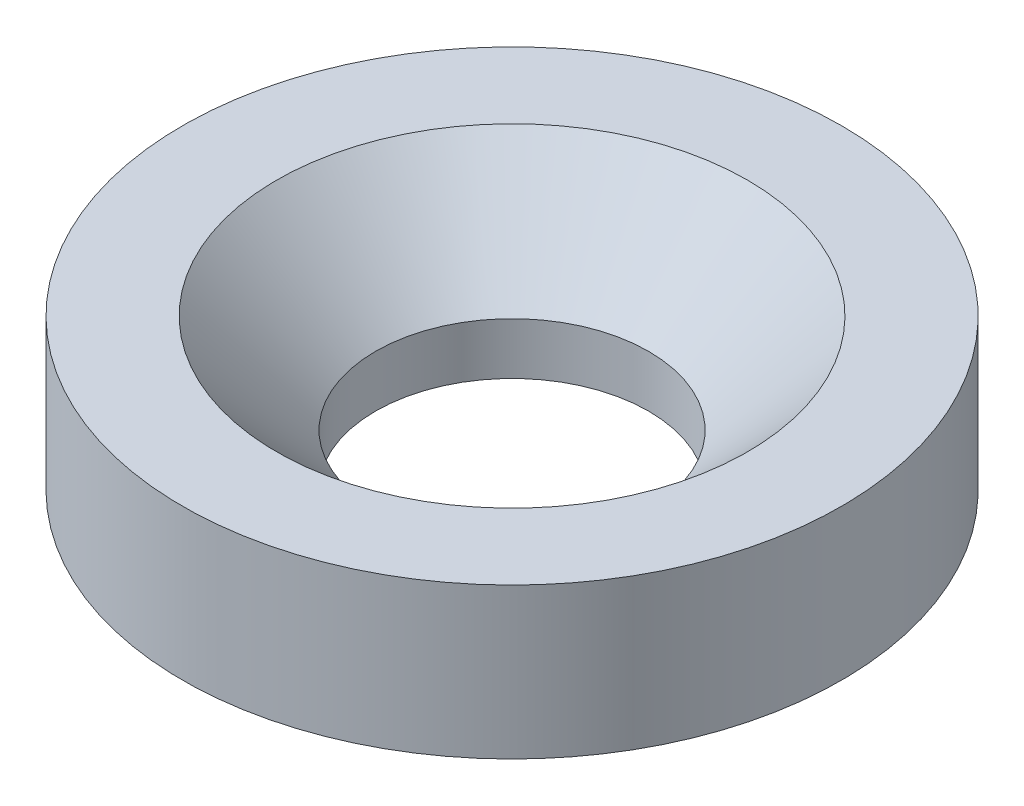
ISO-10303-21;
HEADER;
FILE_DESCRIPTION(('STEP AP214'),'2;1');
FILE_NAME('part.step','',(''),(''),'','','');
FILE_SCHEMA(('AUTOMOTIVE_DESIGN { 1 0 10303 214 1 1 1 1 }'));
ENDSEC;
DATA;
#1=APPLICATION_CONTEXT('core data for automotive mechanical design processes');
#2=APPLICATION_PROTOCOL_DEFINITION('international standard','automotive_design',2000,#1);
#3=PRODUCT_CONTEXT('',#1,'mechanical');
#4=PRODUCT('Part','Part','',(#3));
#5=PRODUCT_RELATED_PRODUCT_CATEGORY('part','',(#4));
#6=PRODUCT_DEFINITION_FORMATION('','',#4);
#7=PRODUCT_DEFINITION_CONTEXT('part definition',#1,'design');
#8=PRODUCT_DEFINITION('design','',#6,#7);
#9=PRODUCT_DEFINITION_SHAPE('','',#8);
#10=(LENGTH_UNIT() NAMED_UNIT(*) SI_UNIT(.MILLI.,.METRE.));
#11=(NAMED_UNIT(*) PLANE_ANGLE_UNIT() SI_UNIT($,.RADIAN.));
#12=(NAMED_UNIT(*) SI_UNIT($,.STERADIAN.) SOLID_ANGLE_UNIT());
#13=UNCERTAINTY_MEASURE_WITH_UNIT(LENGTH_MEASURE(1.E-05),#10,'distance_accuracy_value','');
#14=(GEOMETRIC_REPRESENTATION_CONTEXT(3) GLOBAL_UNCERTAINTY_ASSIGNED_CONTEXT((#13)) GLOBAL_UNIT_ASSIGNED_CONTEXT((#10,
#11,#12)) REPRESENTATION_CONTEXT('',''));
#15=CARTESIAN_POINT('',(0.,0.,0.));
#16=DIRECTION('',(0.,0.,1.));
#17=DIRECTION('',(1.,0.,0.));
#18=AXIS2_PLACEMENT_3D('',#15,#16,#17);
#19=CARTESIAN_POINT('',(0.,0.,0.));
#20=DIRECTION('',(0.,-1.,0.));
#21=DIRECTION('',(0.,0.,-1.));
#22=AXIS2_PLACEMENT_3D('',#19,#20,#21);
#23=CYLINDRICAL_SURFACE('',#22,7.25);
#24=CARTESIAN_POINT('',(0.,0.,0.));
#25=DIRECTION('',(0.,-1.,0.));
#26=DIRECTION('',(0.,0.,-1.));
#27=AXIS2_PLACEMENT_3D('',#24,#25,#26);
#28=CIRCLE('',#27,7.25);
#29=CARTESIAN_POINT('',(0.,0.,-7.25));
#30=VERTEX_POINT('',#29);
#31=EDGE_CURVE('E10',#30,#30,#28,.T.);
#32=ORIENTED_EDGE('',*,*,#31,.T.);
#33=EDGE_LOOP('',(#32));
#34=FACE_BOUND('',#33,.T.);
#35=CARTESIAN_POINT('',(0.,2.74999999999994,0.));
#36=DIRECTION('',(0.,-1.,0.));
#37=DIRECTION('',(0.,0.,-1.));
#38=AXIS2_PLACEMENT_3D('',#35,#36,#37);
#39=CIRCLE('',#38,7.25);
#40=CARTESIAN_POINT('',(0.,2.74999999999994,-7.25));
#41=VERTEX_POINT('',#40);
#42=EDGE_CURVE('E66',#41,#41,#39,.T.);
#43=ORIENTED_EDGE('',*,*,#42,.F.);
#44=EDGE_LOOP('',(#43));
#45=FACE_BOUND('',#44,.T.);
#46=ADVANCED_FACE('F43',(#34,#45),#23,.F.);
#47=CARTESIAN_POINT('',(7.25,0.,0.));
#48=DIRECTION('',(0.,-1.,0.));
#49=DIRECTION('',(0.,0.,-1.));
#50=AXIS2_PLACEMENT_3D('',#47,#48,#49);
#51=PLANE('',#50);
#52=CARTESIAN_POINT('',(0.,0.,0.));
#53=DIRECTION('',(0.,-1.,0.));
#54=DIRECTION('',(0.,0.,-1.));
#55=AXIS2_PLACEMENT_3D('',#52,#53,#54);
#56=CIRCLE('',#55,17.5);
#57=CARTESIAN_POINT('',(0.,0.,-17.5));
#58=VERTEX_POINT('',#57);
#59=EDGE_CURVE('E50',#58,#58,#56,.T.);
#60=ORIENTED_EDGE('',*,*,#59,.T.);
#61=EDGE_LOOP('',(#60));
#62=FACE_BOUND('',#61,.T.);
#63=ORIENTED_EDGE('',*,*,#31,.F.);
#64=EDGE_LOOP('',(#63));
#65=FACE_BOUND('',#64,.T.);
#66=ADVANCED_FACE('F75',(#62,#65),#51,.T.);
#67=CARTESIAN_POINT('',(0.,0.,0.));
#68=DIRECTION('',(0.,-1.,0.));
#69=DIRECTION('',(0.,0.,-1.));
#70=AXIS2_PLACEMENT_3D('',#67,#68,#69);
#71=CYLINDRICAL_SURFACE('',#70,17.5);
#72=CARTESIAN_POINT('',(0.,8.,0.));
#73=DIRECTION('',(0.,-1.,0.));
#74=DIRECTION('',(0.,0.,-1.));
#75=AXIS2_PLACEMENT_3D('',#72,#73,#74);
#76=CIRCLE('',#75,17.5);
#77=CARTESIAN_POINT('',(0.,8.,-17.5));
#78=VERTEX_POINT('',#77);
#79=EDGE_CURVE('E55',#78,#78,#76,.T.);
#80=ORIENTED_EDGE('',*,*,#79,.T.);
#81=EDGE_LOOP('',(#80));
#82=FACE_BOUND('',#81,.T.);
#83=ORIENTED_EDGE('',*,*,#59,.F.);
#84=EDGE_LOOP('',(#83));
#85=FACE_BOUND('',#84,.T.);
#86=ADVANCED_FACE('F79',(#82,#85),#71,.T.);
#87=CARTESIAN_POINT('',(17.5,8.,0.));
#88=DIRECTION('',(0.,1.,0.));
#89=DIRECTION('',(0.,0.,1.));
#90=AXIS2_PLACEMENT_3D('',#87,#88,#89);
#91=PLANE('',#90);
#92=CARTESIAN_POINT('',(0.,8.,0.));
#93=DIRECTION('',(0.,-1.,0.));
#94=DIRECTION('',(0.,0.,-1.));
#95=AXIS2_PLACEMENT_3D('',#92,#93,#94);
#96=CIRCLE('',#95,12.5);
#97=CARTESIAN_POINT('',(0.,8.,-12.5));
#98=VERTEX_POINT('',#97);
#99=EDGE_CURVE('E60',#98,#98,#96,.T.);
#100=ORIENTED_EDGE('',*,*,#99,.T.);
#101=EDGE_LOOP('',(#100));
#102=FACE_BOUND('',#101,.T.);
#103=ORIENTED_EDGE('',*,*,#79,.F.);
#104=EDGE_LOOP('',(#103));
#105=FACE_BOUND('',#104,.T.);
#106=ADVANCED_FACE('F83',(#102,#105),#91,.T.);
#107=CARTESIAN_POINT('',(0.,8.,0.));
#108=DIRECTION('',(0.,1.,0.));
#109=DIRECTION('',(0.,0.,1.));
#110=AXIS2_PLACEMENT_3D('',#107,#108,#109);
#111=CONICAL_SURFACE('',#110,12.5,0.785398163397443);
#112=ORIENTED_EDGE('',*,*,#42,.T.);
#113=EDGE_LOOP('',(#112));
#114=FACE_BOUND('',#113,.T.);
#115=ORIENTED_EDGE('',*,*,#99,.F.);
#116=EDGE_LOOP('',(#115));
#117=FACE_BOUND('',#116,.T.);
#118=ADVANCED_FACE('F71',(#114,#117),#111,.F.);
#119=CLOSED_SHELL('',(#46,#66,#86,#106,#118));
#120=MANIFOLD_SOLID_BREP('B2',#119);
#121=ADVANCED_BREP_SHAPE_REPRESENTATION('',(#18,#120),#14);
#122=SHAPE_DEFINITION_REPRESENTATION(#9,#121);
ENDSEC;
END-ISO-10303-21;
